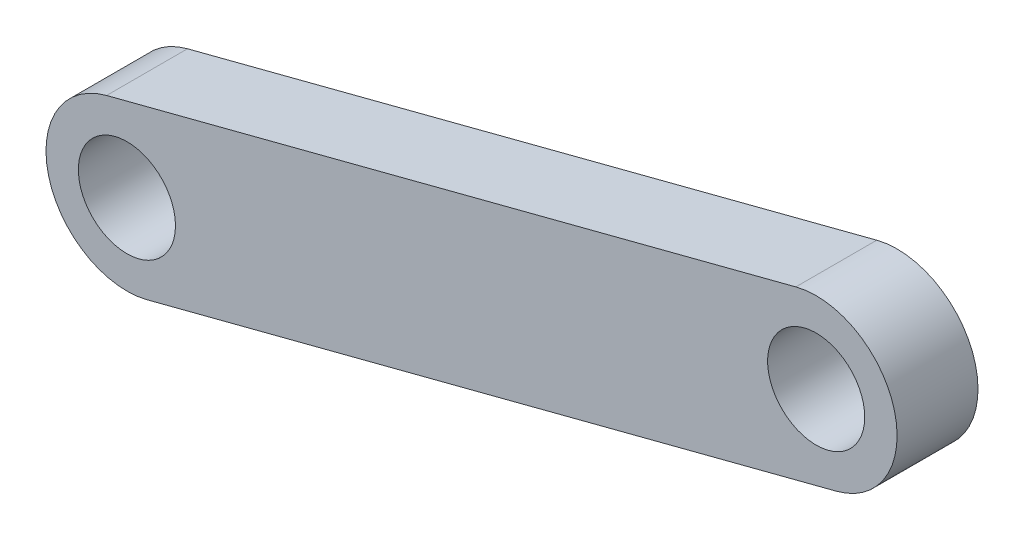
ISO-10303-21;
HEADER;
FILE_DESCRIPTION(('STEP AP214'),'2;1');
FILE_NAME('part.step','',(''),(''),'','','');
FILE_SCHEMA(('AUTOMOTIVE_DESIGN { 1 0 10303 214 1 1 1 1 }'));
ENDSEC;
DATA;
#1=APPLICATION_CONTEXT('core data for automotive mechanical design processes');
#2=APPLICATION_PROTOCOL_DEFINITION('international standard','automotive_design',2000,#1);
#3=PRODUCT_CONTEXT('',#1,'mechanical');
#4=PRODUCT('Part','Part','',(#3));
#5=PRODUCT_RELATED_PRODUCT_CATEGORY('part','',(#4));
#6=PRODUCT_DEFINITION_FORMATION('','',#4);
#7=PRODUCT_DEFINITION_CONTEXT('part definition',#1,'design');
#8=PRODUCT_DEFINITION('design','',#6,#7);
#9=PRODUCT_DEFINITION_SHAPE('','',#8);
#10=(LENGTH_UNIT() NAMED_UNIT(*) SI_UNIT(.MILLI.,.METRE.));
#11=(NAMED_UNIT(*) PLANE_ANGLE_UNIT() SI_UNIT($,.RADIAN.));
#12=(NAMED_UNIT(*) SI_UNIT($,.STERADIAN.) SOLID_ANGLE_UNIT());
#13=UNCERTAINTY_MEASURE_WITH_UNIT(LENGTH_MEASURE(1.E-05),#10,'distance_accuracy_value','');
#14=(GEOMETRIC_REPRESENTATION_CONTEXT(3) GLOBAL_UNCERTAINTY_ASSIGNED_CONTEXT((#13)) GLOBAL_UNIT_ASSIGNED_CONTEXT((#10,
#11,#12)) REPRESENTATION_CONTEXT('',''));
#15=CARTESIAN_POINT('',(0.,0.,0.));
#16=DIRECTION('',(0.,0.,1.));
#17=DIRECTION('',(1.,0.,0.));
#18=AXIS2_PLACEMENT_3D('',#15,#16,#17);
#19=CARTESIAN_POINT('',(-4.11150948786102,15.8443971540323,-2.5));
#20=DIRECTION('',(0.251174112768107,-0.967941922366809,0.));
#21=DIRECTION('',(0.967941922366809,0.251174112768107,0.));
#22=AXIS2_PLACEMENT_3D('',#19,#20,#21);
#23=PLANE('',#22);
#24=DIRECTION('',(-0.967941922366809,-0.251174112768107,0.));
#25=VECTOR('',#24,1.);
#26=CARTESIAN_POINT('',(-4.11150948786102,15.8443971540323,0.));
#27=LINE('',#26,#25);
#28=CARTESIAN_POINT('',(-170.179736797107,-27.2491384078721,0.));
#29=VERTEX_POINT('',#28);
#30=CARTESIAN_POINT('',(-191.474459089177,-32.7749688887705,0.));
#31=VERTEX_POINT('',#30);
#32=EDGE_CURVE('E111',#29,#31,#27,.T.);
#33=ORIENTED_EDGE('',*,*,#32,.F.);
#34=DIRECTION('',(0.,0.,1.));
#35=VECTOR('',#34,1.);
#36=CARTESIAN_POINT('',(-170.179736797107,-27.2491384078721,-2.5));
#37=LINE('',#36,#35);
#38=CARTESIAN_POINT('',(-170.179736797107,-27.2491384078721,-2.5));
#39=VERTEX_POINT('',#38);
#40=EDGE_CURVE('E107',#39,#29,#37,.T.);
#41=ORIENTED_EDGE('',*,*,#40,.F.);
#42=DIRECTION('',(-0.967941922366809,-0.251174112768107,0.));
#43=VECTOR('',#42,1.);
#44=CARTESIAN_POINT('',(-4.11150948786102,15.8443971540323,-2.5));
#45=LINE('',#44,#43);
#46=CARTESIAN_POINT('',(-191.474459089177,-32.7749688887705,-2.5));
#47=VERTEX_POINT('',#46);
#48=EDGE_CURVE('E97',#39,#47,#45,.T.);
#49=ORIENTED_EDGE('',*,*,#48,.T.);
#50=DIRECTION('',(0.,0.,1.));
#51=VECTOR('',#50,1.);
#52=CARTESIAN_POINT('',(-191.474459089177,-32.7749688887705,-2.5));
#53=LINE('',#52,#51);
#54=EDGE_CURVE('E11',#47,#31,#53,.T.);
#55=ORIENTED_EDGE('',*,*,#54,.T.);
#56=EDGE_LOOP('',(#33,#41,#49,#55));
#57=FACE_BOUND('',#56,.T.);
#58=ADVANCED_FACE('F38',(#57),#23,.F.);
#59=CARTESIAN_POINT('',(-190.846523807257,-35.1948236946875,-2.5));
#60=DIRECTION('',(0.,0.,1.));
#61=DIRECTION('',(-1.,0.,0.));
#62=AXIS2_PLACEMENT_3D('',#59,#60,#61);
#63=CYLINDRICAL_SURFACE('',#62,2.5);
#64=CARTESIAN_POINT('',(-190.846523807257,-35.1948236946875,0.));
#65=DIRECTION('',(0.,0.,1.));
#66=DIRECTION('',(1.,0.,0.));
#67=AXIS2_PLACEMENT_3D('',#64,#65,#66);
#68=CIRCLE('',#67,2.5);
#69=CARTESIAN_POINT('',(-190.218588525336,-37.6146785006045,0.));
#70=VERTEX_POINT('',#69);
#71=EDGE_CURVE('E113',#31,#70,#68,.T.);
#72=ORIENTED_EDGE('',*,*,#71,.F.);
#73=ORIENTED_EDGE('',*,*,#54,.F.);
#74=CARTESIAN_POINT('',(-190.846523807257,-35.1948236946875,-2.5));
#75=DIRECTION('',(0.,0.,1.));
#76=DIRECTION('',(1.,0.,0.));
#77=AXIS2_PLACEMENT_3D('',#74,#75,#76);
#78=CIRCLE('',#77,2.5);
#79=CARTESIAN_POINT('',(-190.218588525336,-37.6146785006045,-2.5));
#80=VERTEX_POINT('',#79);
#81=EDGE_CURVE('E80',#47,#80,#78,.T.);
#82=ORIENTED_EDGE('',*,*,#81,.T.);
#83=DIRECTION('',(0.,0.,1.));
#84=VECTOR('',#83,1.);
#85=CARTESIAN_POINT('',(-190.218588525336,-37.6146785006045,-2.5));
#86=LINE('',#85,#84);
#87=EDGE_CURVE('E47',#80,#70,#86,.T.);
#88=ORIENTED_EDGE('',*,*,#87,.T.);
#89=EDGE_LOOP('',(#72,#73,#82,#88));
#90=FACE_BOUND('',#89,.T.);
#91=ADVANCED_FACE('F95',(#90),#63,.T.);
#92=CARTESIAN_POINT('',(-2.85563892401987,11.0046875421963,-2.5));
#93=DIRECTION('',(-0.251174112768097,0.967941922366812,0.));
#94=DIRECTION('',(-0.967941922366812,-0.251174112768097,0.));
#95=AXIS2_PLACEMENT_3D('',#92,#93,#94);
#96=PLANE('',#95);
#97=DIRECTION('',(0.967941922366812,0.251174112768097,0.));
#98=VECTOR('',#97,1.);
#99=CARTESIAN_POINT('',(-2.85563892401987,11.0046875421963,0.));
#100=LINE('',#99,#98);
#101=CARTESIAN_POINT('',(-168.923866233267,-32.0888480197064,0.));
#102=VERTEX_POINT('',#101);
#103=EDGE_CURVE('E91',#70,#102,#100,.T.);
#104=ORIENTED_EDGE('',*,*,#103,.F.);
#105=ORIENTED_EDGE('',*,*,#87,.F.);
#106=DIRECTION('',(0.967941922366812,0.251174112768097,0.));
#107=VECTOR('',#106,1.);
#108=CARTESIAN_POINT('',(-2.85563892401987,11.0046875421963,-2.5));
#109=LINE('',#108,#107);
#110=CARTESIAN_POINT('',(-168.923866233267,-32.0888480197064,-2.5));
#111=VERTEX_POINT('',#110);
#112=EDGE_CURVE('E83',#80,#111,#109,.T.);
#113=ORIENTED_EDGE('',*,*,#112,.T.);
#114=DIRECTION('',(0.,0.,1.));
#115=VECTOR('',#114,1.);
#116=CARTESIAN_POINT('',(-168.923866233267,-32.0888480197064,-2.5));
#117=LINE('',#116,#115);
#118=EDGE_CURVE('E94',#111,#102,#117,.T.);
#119=ORIENTED_EDGE('',*,*,#118,.T.);
#120=EDGE_LOOP('',(#104,#105,#113,#119));
#121=FACE_BOUND('',#120,.T.);
#122=ADVANCED_FACE('F90',(#121),#96,.F.);
#123=CARTESIAN_POINT('',(-169.551801515187,-29.6689932137893,-2.5));
#124=DIRECTION('',(0.,0.,1.));
#125=DIRECTION('',(-1.,0.,0.));
#126=AXIS2_PLACEMENT_3D('',#123,#124,#125);
#127=CYLINDRICAL_SURFACE('',#126,2.50000000000011);
#128=CARTESIAN_POINT('',(-169.551801515187,-29.6689932137893,0.));
#129=DIRECTION('',(0.,0.,1.));
#130=DIRECTION('',(1.,0.,0.));
#131=AXIS2_PLACEMENT_3D('',#128,#129,#130);
#132=CIRCLE('',#131,2.50000000000011);
#133=EDGE_CURVE('E69',#102,#29,#132,.T.);
#134=ORIENTED_EDGE('',*,*,#133,.F.);
#135=ORIENTED_EDGE('',*,*,#118,.F.);
#136=CARTESIAN_POINT('',(-169.551801515187,-29.6689932137893,-2.5));
#137=DIRECTION('',(0.,0.,1.));
#138=DIRECTION('',(1.,0.,0.));
#139=AXIS2_PLACEMENT_3D('',#136,#137,#138);
#140=CIRCLE('',#139,2.50000000000011);
#141=EDGE_CURVE('E55',#111,#39,#140,.T.);
#142=ORIENTED_EDGE('',*,*,#141,.T.);
#143=ORIENTED_EDGE('',*,*,#40,.T.);
#144=EDGE_LOOP('',(#134,#135,#142,#143));
#145=FACE_BOUND('',#144,.T.);
#146=ADVANCED_FACE('F126',(#145),#127,.T.);
#147=CARTESIAN_POINT('',(-190.846523807257,-35.1948236946875,-2.5));
#148=DIRECTION('',(0.,0.,1.));
#149=DIRECTION('',(-1.,0.,0.));
#150=AXIS2_PLACEMENT_3D('',#147,#148,#149);
#151=CYLINDRICAL_SURFACE('',#150,1.50000000000003);
#152=CARTESIAN_POINT('',(-190.846523807257,-35.1948236946875,-2.5));
#153=DIRECTION('',(0.,0.,1.));
#154=DIRECTION('',(1.,0.,0.));
#155=AXIS2_PLACEMENT_3D('',#152,#153,#154);
#156=CIRCLE('',#155,1.50000000000003);
#157=CARTESIAN_POINT('',(-189.346523807257,-35.1948236946875,-2.5));
#158=VERTEX_POINT('',#157);
#159=EDGE_CURVE('E99',#158,#158,#156,.T.);
#160=ORIENTED_EDGE('',*,*,#159,.F.);
#161=EDGE_LOOP('',(#160));
#162=FACE_BOUND('',#161,.T.);
#163=CARTESIAN_POINT('',(-190.846523807257,-35.1948236946875,0.));
#164=DIRECTION('',(0.,0.,1.));
#165=DIRECTION('',(1.,0.,0.));
#166=AXIS2_PLACEMENT_3D('',#163,#164,#165);
#167=CIRCLE('',#166,1.50000000000003);
#168=CARTESIAN_POINT('',(-189.346523807257,-35.1948236946875,0.));
#169=VERTEX_POINT('',#168);
#170=EDGE_CURVE('E108',#169,#169,#167,.T.);
#171=ORIENTED_EDGE('',*,*,#170,.T.);
#172=EDGE_LOOP('',(#171));
#173=FACE_BOUND('',#172,.T.);
#174=ADVANCED_FACE('F40',(#162,#173),#151,.F.);
#175=CARTESIAN_POINT('',(-169.551801515187,-29.6689932137893,-2.5));
#176=DIRECTION('',(0.,0.,1.));
#177=DIRECTION('',(-1.,0.,0.));
#178=AXIS2_PLACEMENT_3D('',#175,#176,#177);
#179=CYLINDRICAL_SURFACE('',#178,1.50001780392866);
#180=CARTESIAN_POINT('',(-169.551801515187,-29.6689932137893,-2.5));
#181=DIRECTION('',(0.,0.,1.));
#182=DIRECTION('',(1.,0.,0.));
#183=AXIS2_PLACEMENT_3D('',#180,#181,#182);
#184=CIRCLE('',#183,1.50001780392866);
#185=CARTESIAN_POINT('',(-168.051783711258,-29.6689932137893,-2.5));
#186=VERTEX_POINT('',#185);
#187=EDGE_CURVE('E104',#186,#186,#184,.T.);
#188=ORIENTED_EDGE('',*,*,#187,.F.);
#189=EDGE_LOOP('',(#188));
#190=FACE_BOUND('',#189,.T.);
#191=CARTESIAN_POINT('',(-169.551801515187,-29.6689932137893,0.));
#192=DIRECTION('',(0.,0.,1.));
#193=DIRECTION('',(1.,0.,0.));
#194=AXIS2_PLACEMENT_3D('',#191,#192,#193);
#195=CIRCLE('',#194,1.50001780392866);
#196=CARTESIAN_POINT('',(-168.051783711258,-29.6689932137893,0.));
#197=VERTEX_POINT('',#196);
#198=EDGE_CURVE('E117',#197,#197,#195,.T.);
#199=ORIENTED_EDGE('',*,*,#198,.T.);
#200=EDGE_LOOP('',(#199));
#201=FACE_BOUND('',#200,.T.);
#202=ADVANCED_FACE('F133',(#190,#201),#179,.F.);
#203=CARTESIAN_POINT('',(0.,0.,-2.5));
#204=DIRECTION('',(0.,0.,-1.));
#205=DIRECTION('',(1.,0.,0.));
#206=AXIS2_PLACEMENT_3D('',#203,#204,#205);
#207=PLANE('',#206);
#208=ORIENTED_EDGE('',*,*,#159,.T.);
#209=EDGE_LOOP('',(#208));
#210=FACE_BOUND('',#209,.T.);
#211=ORIENTED_EDGE('',*,*,#48,.F.);
#212=ORIENTED_EDGE('',*,*,#141,.F.);
#213=ORIENTED_EDGE('',*,*,#112,.F.);
#214=ORIENTED_EDGE('',*,*,#81,.F.);
#215=EDGE_LOOP('',(#211,#212,#213,#214));
#216=FACE_BOUND('',#215,.T.);
#217=ORIENTED_EDGE('',*,*,#187,.T.);
#218=EDGE_LOOP('',(#217));
#219=FACE_BOUND('',#218,.T.);
#220=ADVANCED_FACE('F85',(#210,#216,#219),#207,.T.);
#221=CARTESIAN_POINT('',(0.,0.,0.));
#222=DIRECTION('',(0.,0.,-1.));
#223=DIRECTION('',(1.,0.,0.));
#224=AXIS2_PLACEMENT_3D('',#221,#222,#223);
#225=PLANE('',#224);
#226=ORIENTED_EDGE('',*,*,#170,.F.);
#227=EDGE_LOOP('',(#226));
#228=FACE_BOUND('',#227,.T.);
#229=ORIENTED_EDGE('',*,*,#32,.T.);
#230=ORIENTED_EDGE('',*,*,#71,.T.);
#231=ORIENTED_EDGE('',*,*,#103,.T.);
#232=ORIENTED_EDGE('',*,*,#133,.T.);
#233=EDGE_LOOP('',(#229,#230,#231,#232));
#234=FACE_BOUND('',#233,.T.);
#235=ORIENTED_EDGE('',*,*,#198,.F.);
#236=EDGE_LOOP('',(#235));
#237=FACE_BOUND('',#236,.T.);
#238=ADVANCED_FACE('F121',(#228,#234,#237),#225,.F.);
#239=CLOSED_SHELL('',(#58,#91,#122,#146,#174,#202,#220,#238));
#240=MANIFOLD_SOLID_BREP('B2',#239);
#241=ADVANCED_BREP_SHAPE_REPRESENTATION('',(#18,#240),#14);
#242=SHAPE_DEFINITION_REPRESENTATION(#9,#241);
ENDSEC;
END-ISO-10303-21;
